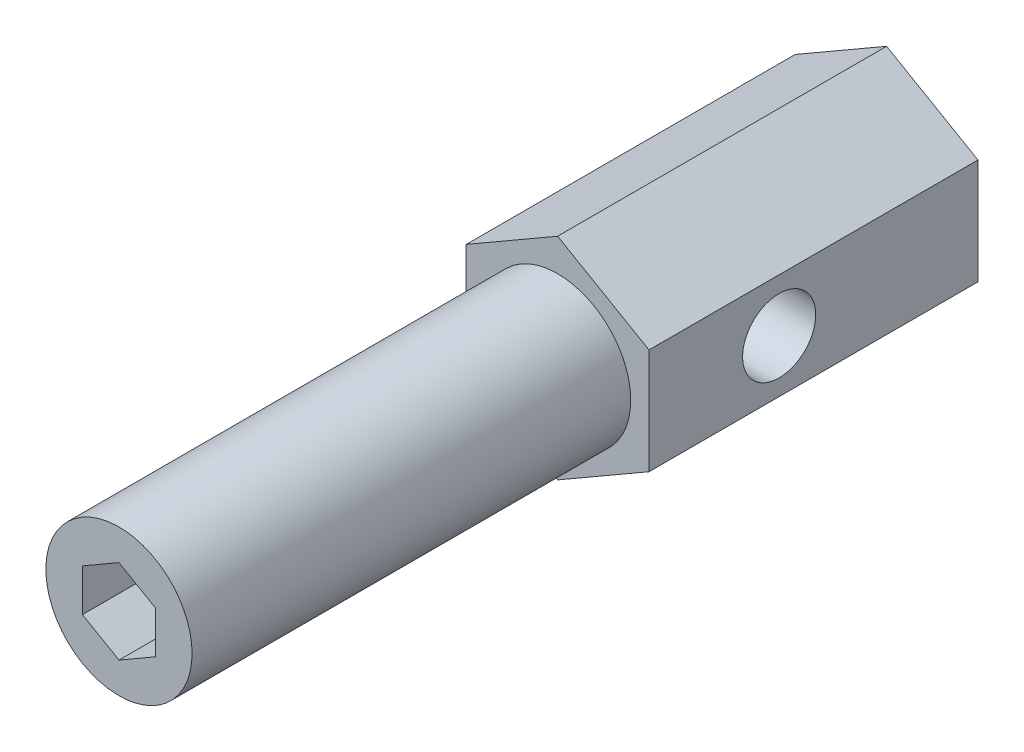
ISO-10303-21;
HEADER;
FILE_DESCRIPTION(('STEP AP214'),'2;1');
FILE_NAME('part.step','',(''),(''),'','','');
FILE_SCHEMA(('AUTOMOTIVE_DESIGN { 1 0 10303 214 1 1 1 1 }'));
ENDSEC;
DATA;
#1=APPLICATION_CONTEXT('core data for automotive mechanical design processes');
#2=APPLICATION_PROTOCOL_DEFINITION('international standard','automotive_design',2000,#1);
#3=PRODUCT_CONTEXT('',#1,'mechanical');
#4=PRODUCT('Part','Part','',(#3));
#5=PRODUCT_RELATED_PRODUCT_CATEGORY('part','',(#4));
#6=PRODUCT_DEFINITION_FORMATION('','',#4);
#7=PRODUCT_DEFINITION_CONTEXT('part definition',#1,'design');
#8=PRODUCT_DEFINITION('design','',#6,#7);
#9=PRODUCT_DEFINITION_SHAPE('','',#8);
#10=(LENGTH_UNIT() NAMED_UNIT(*) SI_UNIT(.MILLI.,.METRE.));
#11=(NAMED_UNIT(*) PLANE_ANGLE_UNIT() SI_UNIT($,.RADIAN.));
#12=(NAMED_UNIT(*) SI_UNIT($,.STERADIAN.) SOLID_ANGLE_UNIT());
#13=UNCERTAINTY_MEASURE_WITH_UNIT(LENGTH_MEASURE(1.E-05),#10,'distance_accuracy_value','');
#14=(GEOMETRIC_REPRESENTATION_CONTEXT(3) GLOBAL_UNCERTAINTY_ASSIGNED_CONTEXT((#13)) GLOBAL_UNIT_ASSIGNED_CONTEXT((#10,
#11,#12)) REPRESENTATION_CONTEXT('',''));
#15=CARTESIAN_POINT('',(0.,0.,0.));
#16=DIRECTION('',(0.,0.,1.));
#17=DIRECTION('',(1.,0.,0.));
#18=AXIS2_PLACEMENT_3D('',#15,#16,#17);
#19=CARTESIAN_POINT('',(0.,0.,152.4));
#20=DIRECTION('',(0.,0.,1.));
#21=DIRECTION('',(1.,0.,0.));
#22=AXIS2_PLACEMENT_3D('',#19,#20,#21);
#23=PLANE('',#22);
#24=DIRECTION('',(-0.866025403784439,0.5,0.));
#25=VECTOR('',#24,1.);
#26=CARTESIAN_POINT('',(6.35,3.66617420935413,152.4));
#27=LINE('',#26,#25);
#28=CARTESIAN_POINT('',(6.35,3.66617420935413,152.4));
#29=VERTEX_POINT('',#28);
#30=CARTESIAN_POINT('',(0.,7.33234841870825,152.4));
#31=VERTEX_POINT('',#30);
#32=EDGE_CURVE('E56',#29,#31,#27,.T.);
#33=ORIENTED_EDGE('',*,*,#32,.F.);
#34=DIRECTION('',(0.,1.,0.));
#35=VECTOR('',#34,1.);
#36=CARTESIAN_POINT('',(6.35,-3.66617420935412,152.4));
#37=LINE('',#36,#35);
#38=CARTESIAN_POINT('',(6.35,-3.66617420935412,152.4));
#39=VERTEX_POINT('',#38);
#40=EDGE_CURVE('E190',#39,#29,#37,.T.);
#41=ORIENTED_EDGE('',*,*,#40,.F.);
#42=DIRECTION('',(0.866025403784439,0.5,0.));
#43=VECTOR('',#42,1.);
#44=CARTESIAN_POINT('',(0.,-7.33234841870825,152.4));
#45=LINE('',#44,#43);
#46=CARTESIAN_POINT('',(0.,-7.33234841870825,152.4));
#47=VERTEX_POINT('',#46);
#48=EDGE_CURVE('E216',#47,#39,#45,.T.);
#49=ORIENTED_EDGE('',*,*,#48,.F.);
#50=DIRECTION('',(0.866025403784438,-0.5,0.));
#51=VECTOR('',#50,1.);
#52=CARTESIAN_POINT('',(-6.35,-3.66617420935412,152.4));
#53=LINE('',#52,#51);
#54=CARTESIAN_POINT('',(-6.35,-3.66617420935412,152.4));
#55=VERTEX_POINT('',#54);
#56=EDGE_CURVE('E213',#55,#47,#53,.T.);
#57=ORIENTED_EDGE('',*,*,#56,.F.);
#58=DIRECTION('',(0.,-1.,0.));
#59=VECTOR('',#58,1.);
#60=CARTESIAN_POINT('',(-6.35,3.66617420935412,152.4));
#61=LINE('',#60,#59);
#62=CARTESIAN_POINT('',(-6.35,3.66617420935412,152.4));
#63=VERTEX_POINT('',#62);
#64=EDGE_CURVE('E210',#63,#55,#61,.T.);
#65=ORIENTED_EDGE('',*,*,#64,.F.);
#66=DIRECTION('',(-0.866025403784439,-0.5,0.));
#67=VECTOR('',#66,1.);
#68=CARTESIAN_POINT('',(0.,7.33234841870825,152.4));
#69=LINE('',#68,#67);
#70=EDGE_CURVE('E207',#31,#63,#69,.T.);
#71=ORIENTED_EDGE('',*,*,#70,.F.);
#72=EDGE_LOOP('',(#33,#41,#49,#57,#65,#71));
#73=FACE_BOUND('',#72,.T.);
#74=CARTESIAN_POINT('',(0.,0.,152.4));
#75=DIRECTION('',(0.,0.,1.));
#76=DIRECTION('',(1.,0.,0.));
#77=AXIS2_PLACEMENT_3D('',#74,#75,#76);
#78=CIRCLE('',#77,12.7);
#79=CARTESIAN_POINT('',(12.7,0.,152.4));
#80=VERTEX_POINT('',#79);
#81=EDGE_CURVE('E412',#80,#80,#78,.T.);
#82=ORIENTED_EDGE('',*,*,#81,.T.);
#83=EDGE_LOOP('',(#82));
#84=FACE_BOUND('',#83,.T.);
#85=ADVANCED_FACE('F34',(#73,#84),#23,.T.);
#86=CARTESIAN_POINT('',(6.35,3.66617420935413,112.268));
#87=DIRECTION('',(0.5,0.866025403784439,0.));
#88=DIRECTION('',(-0.866025403784439,0.5,0.));
#89=AXIS2_PLACEMENT_3D('',#86,#87,#88);
#90=PLANE('',#89);
#91=ORIENTED_EDGE('',*,*,#32,.T.);
#92=DIRECTION('',(0.,0.,1.));
#93=VECTOR('',#92,1.);
#94=CARTESIAN_POINT('',(0.,7.33234841870825,112.268));
#95=LINE('',#94,#93);
#96=CARTESIAN_POINT('',(0.,7.33234841870825,112.268));
#97=VERTEX_POINT('',#96);
#98=EDGE_CURVE('E205',#97,#31,#95,.T.);
#99=ORIENTED_EDGE('',*,*,#98,.F.);
#100=DIRECTION('',(-0.866025403784439,0.5,0.));
#101=VECTOR('',#100,1.);
#102=CARTESIAN_POINT('',(6.35,3.66617420935413,112.268));
#103=LINE('',#102,#101);
#104=CARTESIAN_POINT('',(6.35,3.66617420935413,112.268));
#105=VERTEX_POINT('',#104);
#106=EDGE_CURVE('E186',#105,#97,#103,.T.);
#107=ORIENTED_EDGE('',*,*,#106,.F.);
#108=DIRECTION('',(0.,0.,1.));
#109=VECTOR('',#108,1.);
#110=CARTESIAN_POINT('',(6.35,3.66617420935413,112.268));
#111=LINE('',#110,#109);
#112=EDGE_CURVE('E162',#105,#29,#111,.T.);
#113=ORIENTED_EDGE('',*,*,#112,.T.);
#114=EDGE_LOOP('',(#91,#99,#107,#113));
#115=FACE_BOUND('',#114,.T.);
#116=ADVANCED_FACE('F247',(#115),#90,.F.);
#117=CARTESIAN_POINT('',(6.35,-3.66617420935412,112.268));
#118=DIRECTION('',(1.,0.,0.));
#119=DIRECTION('',(0.,1.,0.));
#120=AXIS2_PLACEMENT_3D('',#117,#118,#119);
#121=PLANE('',#120);
#122=ORIENTED_EDGE('',*,*,#40,.T.);
#123=ORIENTED_EDGE('',*,*,#112,.F.);
#124=DIRECTION('',(0.,1.,0.));
#125=VECTOR('',#124,1.);
#126=CARTESIAN_POINT('',(6.35,-3.66617420935412,112.268));
#127=LINE('',#126,#125);
#128=CARTESIAN_POINT('',(6.35,-3.66617420935412,112.268));
#129=VERTEX_POINT('',#128);
#130=EDGE_CURVE('E202',#129,#105,#127,.T.);
#131=ORIENTED_EDGE('',*,*,#130,.F.);
#132=DIRECTION('',(0.,0.,1.));
#133=VECTOR('',#132,1.);
#134=CARTESIAN_POINT('',(6.35,-3.66617420935412,112.268));
#135=LINE('',#134,#133);
#136=EDGE_CURVE('E222',#129,#39,#135,.T.);
#137=ORIENTED_EDGE('',*,*,#136,.T.);
#138=EDGE_LOOP('',(#122,#123,#131,#137));
#139=FACE_BOUND('',#138,.T.);
#140=ADVANCED_FACE('F249',(#139),#121,.F.);
#141=CARTESIAN_POINT('',(0.,-7.33234841870825,112.268));
#142=DIRECTION('',(0.5,-0.866025403784439,0.));
#143=DIRECTION('',(0.866025403784439,0.5,0.));
#144=AXIS2_PLACEMENT_3D('',#141,#142,#143);
#145=PLANE('',#144);
#146=ORIENTED_EDGE('',*,*,#48,.T.);
#147=ORIENTED_EDGE('',*,*,#136,.F.);
#148=DIRECTION('',(0.866025403784439,0.5,0.));
#149=VECTOR('',#148,1.);
#150=CARTESIAN_POINT('',(0.,-7.33234841870825,112.268));
#151=LINE('',#150,#149);
#152=CARTESIAN_POINT('',(0.,-7.33234841870825,112.268));
#153=VERTEX_POINT('',#152);
#154=EDGE_CURVE('E199',#153,#129,#151,.T.);
#155=ORIENTED_EDGE('',*,*,#154,.F.);
#156=DIRECTION('',(0.,0.,1.));
#157=VECTOR('',#156,1.);
#158=CARTESIAN_POINT('',(0.,-7.33234841870825,112.268));
#159=LINE('',#158,#157);
#160=EDGE_CURVE('E224',#153,#47,#159,.T.);
#161=ORIENTED_EDGE('',*,*,#160,.T.);
#162=EDGE_LOOP('',(#146,#147,#155,#161));
#163=FACE_BOUND('',#162,.T.);
#164=ADVANCED_FACE('F251',(#163),#145,.F.);
#165=CARTESIAN_POINT('',(-6.35,-3.66617420935412,112.268));
#166=DIRECTION('',(-0.5,-0.866025403784439,0.));
#167=DIRECTION('',(0.866025403784439,-0.5,0.));
#168=AXIS2_PLACEMENT_3D('',#165,#166,#167);
#169=PLANE('',#168);
#170=ORIENTED_EDGE('',*,*,#56,.T.);
#171=ORIENTED_EDGE('',*,*,#160,.F.);
#172=DIRECTION('',(0.866025403784438,-0.5,0.));
#173=VECTOR('',#172,1.);
#174=CARTESIAN_POINT('',(-6.35,-3.66617420935412,112.268));
#175=LINE('',#174,#173);
#176=CARTESIAN_POINT('',(-6.35,-3.66617420935412,112.268));
#177=VERTEX_POINT('',#176);
#178=EDGE_CURVE('E196',#177,#153,#175,.T.);
#179=ORIENTED_EDGE('',*,*,#178,.F.);
#180=DIRECTION('',(0.,0.,1.));
#181=VECTOR('',#180,1.);
#182=CARTESIAN_POINT('',(-6.35,-3.66617420935412,112.268));
#183=LINE('',#182,#181);
#184=EDGE_CURVE('E226',#177,#55,#183,.T.);
#185=ORIENTED_EDGE('',*,*,#184,.T.);
#186=EDGE_LOOP('',(#170,#171,#179,#185));
#187=FACE_BOUND('',#186,.T.);
#188=ADVANCED_FACE('F254',(#187),#169,.F.);
#189=CARTESIAN_POINT('',(-6.35,3.66617420935412,112.268));
#190=DIRECTION('',(-1.,0.,0.));
#191=DIRECTION('',(0.,0.,1.));
#192=AXIS2_PLACEMENT_3D('',#189,#190,#191);
#193=PLANE('',#192);
#194=ORIENTED_EDGE('',*,*,#64,.T.);
#195=ORIENTED_EDGE('',*,*,#184,.F.);
#196=DIRECTION('',(0.,-1.,0.));
#197=VECTOR('',#196,1.);
#198=CARTESIAN_POINT('',(-6.35,3.66617420935412,112.268));
#199=LINE('',#198,#197);
#200=CARTESIAN_POINT('',(-6.35,3.66617420935412,112.268));
#201=VERTEX_POINT('',#200);
#202=EDGE_CURVE('E193',#201,#177,#199,.T.);
#203=ORIENTED_EDGE('',*,*,#202,.F.);
#204=DIRECTION('',(0.,0.,1.));
#205=VECTOR('',#204,1.);
#206=CARTESIAN_POINT('',(-6.35,3.66617420935412,112.268));
#207=LINE('',#206,#205);
#208=EDGE_CURVE('E228',#201,#63,#207,.T.);
#209=ORIENTED_EDGE('',*,*,#208,.T.);
#210=EDGE_LOOP('',(#194,#195,#203,#209));
#211=FACE_BOUND('',#210,.T.);
#212=ADVANCED_FACE('F241',(#211),#193,.F.);
#213=CARTESIAN_POINT('',(0.,7.33234841870825,112.268));
#214=DIRECTION('',(-0.5,0.866025403784439,0.));
#215=DIRECTION('',(-0.866025403784439,-0.5,0.));
#216=AXIS2_PLACEMENT_3D('',#213,#214,#215);
#217=PLANE('',#216);
#218=ORIENTED_EDGE('',*,*,#70,.T.);
#219=ORIENTED_EDGE('',*,*,#208,.F.);
#220=DIRECTION('',(-0.866025403784439,-0.5,0.));
#221=VECTOR('',#220,1.);
#222=CARTESIAN_POINT('',(0.,7.33234841870825,112.268));
#223=LINE('',#222,#221);
#224=EDGE_CURVE('E189',#97,#201,#223,.T.);
#225=ORIENTED_EDGE('',*,*,#224,.F.);
#226=ORIENTED_EDGE('',*,*,#98,.T.);
#227=EDGE_LOOP('',(#218,#219,#225,#226));
#228=FACE_BOUND('',#227,.T.);
#229=ADVANCED_FACE('F232',(#228),#217,.F.);
#230=CARTESIAN_POINT('',(0.,0.,112.268));
#231=DIRECTION('',(0.,0.,1.));
#232=DIRECTION('',(1.,0.,0.));
#233=AXIS2_PLACEMENT_3D('',#230,#231,#232);
#234=PLANE('',#233);
#235=ORIENTED_EDGE('',*,*,#106,.T.);
#236=ORIENTED_EDGE('',*,*,#224,.T.);
#237=ORIENTED_EDGE('',*,*,#202,.T.);
#238=ORIENTED_EDGE('',*,*,#178,.T.);
#239=ORIENTED_EDGE('',*,*,#154,.T.);
#240=ORIENTED_EDGE('',*,*,#130,.T.);
#241=EDGE_LOOP('',(#235,#236,#237,#238,#239,#240));
#242=FACE_BOUND('',#241,.T.);
#243=ADVANCED_FACE('F245',(#242),#234,.T.);
#244=CARTESIAN_POINT('',(0.,0.,76.2));
#245=DIRECTION('',(0.,0.,1.));
#246=DIRECTION('',(1.,0.,0.));
#247=AXIS2_PLACEMENT_3D('',#244,#245,#246);
#248=PLANE('',#247);
#249=CARTESIAN_POINT('',(0.,0.,76.2));
#250=DIRECTION('',(0.,0.,1.));
#251=DIRECTION('',(1.,0.,0.));
#252=AXIS2_PLACEMENT_3D('',#249,#250,#251);
#253=CIRCLE('',#252,12.7);
#254=CARTESIAN_POINT('',(12.7,0.,76.2));
#255=VERTEX_POINT('',#254);
#256=EDGE_CURVE('E411',#255,#255,#253,.T.);
#257=ORIENTED_EDGE('',*,*,#256,.F.);
#258=EDGE_LOOP('',(#257));
#259=FACE_BOUND('',#258,.T.);
#260=DIRECTION('',(-0.866025403784439,0.5,0.));
#261=VECTOR('',#260,1.);
#262=CARTESIAN_POINT('',(15.875,9.16543552338531,76.2));
#263=LINE('',#262,#261);
#264=CARTESIAN_POINT('',(15.875,9.16543552338531,76.2));
#265=VERTEX_POINT('',#264);
#266=CARTESIAN_POINT('',(0.,18.3308710467706,76.2));
#267=VERTEX_POINT('',#266);
#268=EDGE_CURVE('E121',#265,#267,#263,.T.);
#269=ORIENTED_EDGE('',*,*,#268,.T.);
#270=DIRECTION('',(-0.866025403784438,-0.5,0.));
#271=VECTOR('',#270,1.);
#272=CARTESIAN_POINT('',(0.,18.3308710467706,76.2));
#273=LINE('',#272,#271);
#274=CARTESIAN_POINT('',(-15.875,9.1654355233853,76.2));
#275=VERTEX_POINT('',#274);
#276=EDGE_CURVE('E131',#267,#275,#273,.T.);
#277=ORIENTED_EDGE('',*,*,#276,.T.);
#278=DIRECTION('',(0.,-1.,0.));
#279=VECTOR('',#278,1.);
#280=CARTESIAN_POINT('',(-15.875,9.1654355233853,76.2));
#281=LINE('',#280,#279);
#282=CARTESIAN_POINT('',(-15.875,-9.16543552338533,76.2));
#283=VERTEX_POINT('',#282);
#284=EDGE_CURVE('E178',#275,#283,#281,.T.);
#285=ORIENTED_EDGE('',*,*,#284,.T.);
#286=DIRECTION('',(0.866025403784439,-0.5,0.));
#287=VECTOR('',#286,1.);
#288=CARTESIAN_POINT('',(-15.875,-9.16543552338532,76.2));
#289=LINE('',#288,#287);
#290=CARTESIAN_POINT('',(0.,-18.3308710467706,76.2));
#291=VERTEX_POINT('',#290);
#292=EDGE_CURVE('E180',#283,#291,#289,.T.);
#293=ORIENTED_EDGE('',*,*,#292,.T.);
#294=DIRECTION('',(0.866025403784439,0.5,0.));
#295=VECTOR('',#294,1.);
#296=CARTESIAN_POINT('',(0.,-18.3308710467706,76.2));
#297=LINE('',#296,#295);
#298=CARTESIAN_POINT('',(15.875,-9.16543552338531,76.2));
#299=VERTEX_POINT('',#298);
#300=EDGE_CURVE('E48',#291,#299,#297,.T.);
#301=ORIENTED_EDGE('',*,*,#300,.T.);
#302=DIRECTION('',(0.,1.,0.));
#303=VECTOR('',#302,1.);
#304=CARTESIAN_POINT('',(15.875,-9.16543552338531,76.2));
#305=LINE('',#304,#303);
#306=EDGE_CURVE('E11',#299,#265,#305,.T.);
#307=ORIENTED_EDGE('',*,*,#306,.T.);
#308=EDGE_LOOP('',(#269,#277,#285,#293,#301,#307));
#309=FACE_BOUND('',#308,.T.);
#310=ADVANCED_FACE('F120',(#259,#309),#248,.T.);
#311=CARTESIAN_POINT('',(0.,0.,76.2));
#312=DIRECTION('',(0.,0.,1.));
#313=DIRECTION('',(1.,0.,0.));
#314=AXIS2_PLACEMENT_3D('',#311,#312,#313);
#315=CYLINDRICAL_SURFACE('',#314,12.7);
#316=CARTESIAN_POINT('',(12.7,0.,76.2));
#317=CARTESIAN_POINT('',(12.7,0.,76.99375));
#318=CARTESIAN_POINT('',(12.7,0.,77.7875));
#319=CARTESIAN_POINT('',(12.7,0.,79.375));
#320=CARTESIAN_POINT('',(12.7,0.,80.16875));
#321=CARTESIAN_POINT('',(12.7,0.,81.75625));
#322=CARTESIAN_POINT('',(12.7,0.,82.55));
#323=CARTESIAN_POINT('',(12.7,0.,84.1375));
#324=CARTESIAN_POINT('',(12.7,0.,84.93125));
#325=CARTESIAN_POINT('',(12.7,0.,86.51875));
#326=CARTESIAN_POINT('',(12.7,0.,87.3125));
#327=CARTESIAN_POINT('',(12.7,0.,88.9));
#328=CARTESIAN_POINT('',(12.7,0.,89.69375));
#329=CARTESIAN_POINT('',(12.7,0.,91.28125));
#330=CARTESIAN_POINT('',(12.7,0.,92.075));
#331=CARTESIAN_POINT('',(12.7,0.,93.6625));
#332=CARTESIAN_POINT('',(12.7,0.,94.45625));
#333=CARTESIAN_POINT('',(12.7,0.,96.04375));
#334=CARTESIAN_POINT('',(12.7,0.,96.8375));
#335=CARTESIAN_POINT('',(12.7,0.,98.425));
#336=CARTESIAN_POINT('',(12.7,0.,99.21875));
#337=CARTESIAN_POINT('',(12.7,0.,100.80625));
#338=CARTESIAN_POINT('',(12.7,0.,101.6));
#339=CARTESIAN_POINT('',(12.7,0.,103.1875));
#340=CARTESIAN_POINT('',(12.7,0.,103.98125));
#341=CARTESIAN_POINT('',(12.7,0.,105.56875));
#342=CARTESIAN_POINT('',(12.7,0.,106.3625));
#343=CARTESIAN_POINT('',(12.7,0.,107.95));
#344=CARTESIAN_POINT('',(12.7,0.,108.74375));
#345=CARTESIAN_POINT('',(12.7,0.,110.33125));
#346=CARTESIAN_POINT('',(12.7,0.,111.125));
#347=CARTESIAN_POINT('',(12.7,0.,112.7125));
#348=CARTESIAN_POINT('',(12.7,0.,113.50625));
#349=CARTESIAN_POINT('',(12.7,0.,115.09375));
#350=CARTESIAN_POINT('',(12.7,0.,115.8875));
#351=CARTESIAN_POINT('',(12.7,0.,117.475));
#352=CARTESIAN_POINT('',(12.7,0.,118.26875));
#353=CARTESIAN_POINT('',(12.7,0.,119.85625));
#354=CARTESIAN_POINT('',(12.7,0.,120.65));
#355=CARTESIAN_POINT('',(12.7,0.,122.2375));
#356=CARTESIAN_POINT('',(12.7,0.,123.03125));
#357=CARTESIAN_POINT('',(12.7,0.,124.61875));
#358=CARTESIAN_POINT('',(12.7,0.,125.4125));
#359=CARTESIAN_POINT('',(12.7,0.,127.));
#360=CARTESIAN_POINT('',(12.7,0.,127.79375));
#361=CARTESIAN_POINT('',(12.7,0.,129.38125));
#362=CARTESIAN_POINT('',(12.7,0.,130.175));
#363=CARTESIAN_POINT('',(12.7,0.,131.7625));
#364=CARTESIAN_POINT('',(12.7,0.,132.55625));
#365=CARTESIAN_POINT('',(12.7,0.,134.14375));
#366=CARTESIAN_POINT('',(12.7,0.,134.9375));
#367=CARTESIAN_POINT('',(12.7,0.,136.525));
#368=CARTESIAN_POINT('',(12.7,0.,137.31875));
#369=CARTESIAN_POINT('',(12.7,0.,138.90625));
#370=CARTESIAN_POINT('',(12.7,0.,139.7));
#371=CARTESIAN_POINT('',(12.7,0.,141.2875));
#372=CARTESIAN_POINT('',(12.7,0.,142.08125));
#373=CARTESIAN_POINT('',(12.7,0.,143.66875));
#374=CARTESIAN_POINT('',(12.7,0.,144.4625));
#375=CARTESIAN_POINT('',(12.7,0.,146.05));
#376=CARTESIAN_POINT('',(12.7,0.,146.84375));
#377=CARTESIAN_POINT('',(12.7,0.,148.43125));
#378=CARTESIAN_POINT('',(12.7,0.,149.225));
#379=CARTESIAN_POINT('',(12.7,0.,150.8125));
#380=CARTESIAN_POINT('',(12.7,0.,151.60625));
#381=CARTESIAN_POINT('',(12.7,0.,152.4));
#382=B_SPLINE_CURVE_WITH_KNOTS('',3,(#316,#317,#318,#319,#320,#321,#322,#323,#324,#325,#326,
#327,#328,#329,#330,#331,#332,#333,#334,#335,#336,#337,#338,#339,#340,#341,#342,#343,#344,#345,
#346,#347,#348,#349,#350,#351,#352,#353,#354,#355,#356,#357,#358,#359,#360,#361,#362,#363,#364,
#365,#366,#367,#368,#369,#370,#371,#372,#373,#374,#375,#376,#377,#378,#379,#380,#381),
.UNSPECIFIED.,.F.,.F.,(4,2,2,2,2,2,2,2,2,2,2,2,2,2,2,2,2,2,2,2,2,2,2,2,2,2,2,2,2,2,2,2,4),(0.,
2.38125,4.7625,7.14375,9.52500000000001,11.90625,14.2875,16.66875,19.05,21.43125,23.8125,
26.19375,28.575,30.95625,33.3375,35.71875,38.1,40.48125,42.8625,45.24375,47.625,50.00625,
52.3875,54.76875,57.15,59.53125,61.9125,64.29375,66.675,69.05625,71.4375,73.81875,76.2),.UNSPECIFIED.);
#383=EDGE_CURVE('BSEAM301',#255,#80,#382,.T.);
#384=ORIENTED_EDGE('',*,*,#256,.T.);
#385=ORIENTED_EDGE('',*,*,#81,.F.);
#386=ORIENTED_EDGE('',*,*,#383,.T.);
#387=ORIENTED_EDGE('',*,*,#383,.F.);
#388=EDGE_LOOP('',(#384,#386,#385,#387));
#389=FACE_BOUND('',#388,.T.);
#390=ADVANCED_FACE('F301',(#389),#315,.T.);
#391=CARTESIAN_POINT('',(0.,0.,19.05));
#392=DIRECTION('',(0.,0.,-1.));
#393=DIRECTION('',(-1.,0.,0.));
#394=AXIS2_PLACEMENT_3D('',#391,#392,#393);
#395=PLANE('',#394);
#396=DIRECTION('',(0.866025403784441,0.499999999999995,0.));
#397=VECTOR('',#396,1.);
#398=CARTESIAN_POINT('',(-15.8749999999999,9.16543552338549,19.05));
#399=LINE('',#398,#397);
#400=CARTESIAN_POINT('',(-15.8749999999999,9.16543552338549,19.05));
#401=VERTEX_POINT('',#400);
#402=CARTESIAN_POINT('',(0.,18.3308710467706,19.05));
#403=VERTEX_POINT('',#402);
#404=EDGE_CURVE('E156',#401,#403,#399,.T.);
#405=ORIENTED_EDGE('',*,*,#404,.T.);
#406=DIRECTION('',(0.866025403784438,-0.500000000000001,0.));
#407=VECTOR('',#406,1.);
#408=CARTESIAN_POINT('',(0.,18.3308710467706,19.05));
#409=LINE('',#408,#407);
#410=CARTESIAN_POINT('',(15.875,9.16543552338531,19.05));
#411=VERTEX_POINT('',#410);
#412=EDGE_CURVE('E159',#403,#411,#409,.T.);
#413=ORIENTED_EDGE('',*,*,#412,.T.);
#414=DIRECTION('',(0.,-1.,0.));
#415=VECTOR('',#414,1.);
#416=CARTESIAN_POINT('',(15.875,9.16543552338528,19.05));
#417=LINE('',#416,#415);
#418=CARTESIAN_POINT('',(15.875,-9.16543552338537,19.05));
#419=VERTEX_POINT('',#418);
#420=EDGE_CURVE('E136',#411,#419,#417,.T.);
#421=ORIENTED_EDGE('',*,*,#420,.T.);
#422=DIRECTION('',(-0.866025403784441,-0.499999999999995,0.));
#423=VECTOR('',#422,1.);
#424=CARTESIAN_POINT('',(15.875,-9.16543552338537,19.05));
#425=LINE('',#424,#423);
#426=CARTESIAN_POINT('',(-1.17397558148957E-13,-18.3308710467706,19.05));
#427=VERTEX_POINT('',#426);
#428=EDGE_CURVE('E165',#419,#427,#425,.T.);
#429=ORIENTED_EDGE('',*,*,#428,.T.);
#430=DIRECTION('',(-0.866025403784435,0.500000000000007,0.));
#431=VECTOR('',#430,1.);
#432=CARTESIAN_POINT('',(-1.17397558148957E-13,-18.3308710467706,19.05));
#433=LINE('',#432,#431);
#434=CARTESIAN_POINT('',(-15.8750000000001,-9.16543552338517,19.05));
#435=VERTEX_POINT('',#434);
#436=EDGE_CURVE('E143',#427,#435,#433,.T.);
#437=ORIENTED_EDGE('',*,*,#436,.T.);
#438=DIRECTION('',(0.,1.,0.));
#439=VECTOR('',#438,1.);
#440=CARTESIAN_POINT('',(-15.8750000000001,-9.16543552338517,19.05));
#441=LINE('',#440,#439);
#442=EDGE_CURVE('E138',#435,#401,#441,.T.);
#443=ORIENTED_EDGE('',*,*,#442,.T.);
#444=EDGE_LOOP('',(#405,#413,#421,#429,#437,#443));
#445=FACE_BOUND('',#444,.T.);
#446=ADVANCED_FACE('F158',(#445),#395,.T.);
#447=CARTESIAN_POINT('',(15.875,-9.16543552338531,152.4));
#448=DIRECTION('',(-1.,0.,0.));
#449=DIRECTION('',(0.,0.,1.));
#450=AXIS2_PLACEMENT_3D('',#447,#448,#449);
#451=PLANE('',#450);
#452=CARTESIAN_POINT('',(15.875,0.,53.594));
#453=DIRECTION('',(1.,0.,0.));
#454=DIRECTION('',(0.,0.,-1.));
#455=AXIS2_PLACEMENT_3D('',#452,#453,#454);
#456=CIRCLE('',#455,6.35);
#457=CARTESIAN_POINT('',(15.875,0.,47.244));
#458=VERTEX_POINT('',#457);
#459=EDGE_CURVE('E418',#458,#458,#456,.T.);
#460=ORIENTED_EDGE('',*,*,#459,.F.);
#461=EDGE_LOOP('',(#460));
#462=FACE_BOUND('',#461,.T.);
#463=ORIENTED_EDGE('',*,*,#306,.F.);
#464=DIRECTION('',(0.,0.,-1.));
#465=VECTOR('',#464,1.);
#466=CARTESIAN_POINT('',(15.875,-9.16543552338531,152.4));
#467=LINE('',#466,#465);
#468=EDGE_CURVE('E137',#299,#419,#467,.T.);
#469=ORIENTED_EDGE('',*,*,#468,.T.);
#470=ORIENTED_EDGE('',*,*,#420,.F.);
#471=DIRECTION('',(0.,0.,-1.));
#472=VECTOR('',#471,1.);
#473=CARTESIAN_POINT('',(15.875,9.16543552338531,152.4));
#474=LINE('',#473,#472);
#475=EDGE_CURVE('E129',#265,#411,#474,.T.);
#476=ORIENTED_EDGE('',*,*,#475,.F.);
#477=EDGE_LOOP('',(#463,#469,#470,#476));
#478=FACE_BOUND('',#477,.T.);
#479=ADVANCED_FACE('F134',(#462,#478),#451,.F.);
#480=CARTESIAN_POINT('',(0.,-18.3308710467706,152.4));
#481=DIRECTION('',(-0.5,0.866025403784439,0.));
#482=DIRECTION('',(-0.866025403784439,-0.5,0.));
#483=AXIS2_PLACEMENT_3D('',#480,#481,#482);
#484=PLANE('',#483);
#485=ORIENTED_EDGE('',*,*,#300,.F.);
#486=DIRECTION('',(0.,0.,-1.));
#487=VECTOR('',#486,1.);
#488=CARTESIAN_POINT('',(0.,-18.3308710467706,152.4));
#489=LINE('',#488,#487);
#490=EDGE_CURVE('E140',#291,#427,#489,.T.);
#491=ORIENTED_EDGE('',*,*,#490,.T.);
#492=ORIENTED_EDGE('',*,*,#428,.F.);
#493=ORIENTED_EDGE('',*,*,#468,.F.);
#494=EDGE_LOOP('',(#485,#491,#492,#493));
#495=FACE_BOUND('',#494,.T.);
#496=ADVANCED_FACE('F275',(#495),#484,.F.);
#497=CARTESIAN_POINT('',(-15.875,-9.16543552338532,152.4));
#498=DIRECTION('',(0.5,0.866025403784439,0.));
#499=DIRECTION('',(-0.866025403784439,0.5,0.));
#500=AXIS2_PLACEMENT_3D('',#497,#498,#499);
#501=PLANE('',#500);
#502=ORIENTED_EDGE('',*,*,#292,.F.);
#503=DIRECTION('',(0.,0.,-1.));
#504=VECTOR('',#503,1.);
#505=CARTESIAN_POINT('',(-15.875,-9.16543552338532,152.4));
#506=LINE('',#505,#504);
#507=EDGE_CURVE('E148',#283,#435,#506,.T.);
#508=ORIENTED_EDGE('',*,*,#507,.T.);
#509=ORIENTED_EDGE('',*,*,#436,.F.);
#510=ORIENTED_EDGE('',*,*,#490,.F.);
#511=EDGE_LOOP('',(#502,#508,#509,#510));
#512=FACE_BOUND('',#511,.T.);
#513=ADVANCED_FACE('F279',(#512),#501,.F.);
#514=CARTESIAN_POINT('',(-15.875,9.1654355233853,152.4));
#515=DIRECTION('',(1.,0.,0.));
#516=DIRECTION('',(0.,1.,0.));
#517=AXIS2_PLACEMENT_3D('',#514,#515,#516);
#518=PLANE('',#517);
#519=CARTESIAN_POINT('',(-15.8750000000001,0.,53.594));
#520=DIRECTION('',(1.,0.,0.));
#521=DIRECTION('',(0.,0.,-1.));
#522=AXIS2_PLACEMENT_3D('',#519,#520,#521);
#523=CIRCLE('',#522,6.35);
#524=CARTESIAN_POINT('',(-15.8750000000001,0.,47.244));
#525=VERTEX_POINT('',#524);
#526=EDGE_CURVE('E415',#525,#525,#523,.T.);
#527=ORIENTED_EDGE('',*,*,#526,.T.);
#528=EDGE_LOOP('',(#527));
#529=FACE_BOUND('',#528,.T.);
#530=ORIENTED_EDGE('',*,*,#284,.F.);
#531=DIRECTION('',(0.,0.,-1.));
#532=VECTOR('',#531,1.);
#533=CARTESIAN_POINT('',(-15.875,9.1654355233853,152.4));
#534=LINE('',#533,#532);
#535=EDGE_CURVE('E150',#275,#401,#534,.T.);
#536=ORIENTED_EDGE('',*,*,#535,.T.);
#537=ORIENTED_EDGE('',*,*,#442,.F.);
#538=ORIENTED_EDGE('',*,*,#507,.F.);
#539=EDGE_LOOP('',(#530,#536,#537,#538));
#540=FACE_BOUND('',#539,.T.);
#541=ADVANCED_FACE('F177',(#529,#540),#518,.F.);
#542=CARTESIAN_POINT('',(0.,18.3308710467706,152.4));
#543=DIRECTION('',(0.5,-0.866025403784438,0.));
#544=DIRECTION('',(0.866025403784438,0.5,0.));
#545=AXIS2_PLACEMENT_3D('',#542,#543,#544);
#546=PLANE('',#545);
#547=ORIENTED_EDGE('',*,*,#276,.F.);
#548=DIRECTION('',(0.,0.,-1.));
#549=VECTOR('',#548,1.);
#550=CARTESIAN_POINT('',(0.,18.3308710467706,152.4));
#551=LINE('',#550,#549);
#552=EDGE_CURVE('E42',#267,#403,#551,.T.);
#553=ORIENTED_EDGE('',*,*,#552,.T.);
#554=ORIENTED_EDGE('',*,*,#404,.F.);
#555=ORIENTED_EDGE('',*,*,#535,.F.);
#556=EDGE_LOOP('',(#547,#553,#554,#555));
#557=FACE_BOUND('',#556,.T.);
#558=ADVANCED_FACE('F154',(#557),#546,.F.);
#559=CARTESIAN_POINT('',(15.875,9.16543552338531,152.4));
#560=DIRECTION('',(-0.5,-0.866025403784439,0.));
#561=DIRECTION('',(0.866025403784439,-0.5,0.));
#562=AXIS2_PLACEMENT_3D('',#559,#560,#561);
#563=PLANE('',#562);
#564=ORIENTED_EDGE('',*,*,#268,.F.);
#565=ORIENTED_EDGE('',*,*,#475,.T.);
#566=ORIENTED_EDGE('',*,*,#412,.F.);
#567=ORIENTED_EDGE('',*,*,#552,.F.);
#568=EDGE_LOOP('',(#564,#565,#566,#567));
#569=FACE_BOUND('',#568,.T.);
#570=ADVANCED_FACE('F36',(#569),#563,.F.);
#571=CARTESIAN_POINT('',(-15.8750000000001,0.,53.594));
#572=DIRECTION('',(1.,0.,0.));
#573=DIRECTION('',(0.,0.,-1.));
#574=AXIS2_PLACEMENT_3D('',#571,#572,#573);
#575=CYLINDRICAL_SURFACE('',#574,6.35);
#576=ORIENTED_EDGE('',*,*,#526,.F.);
#577=EDGE_LOOP('',(#576));
#578=FACE_BOUND('',#577,.T.);
#579=ORIENTED_EDGE('',*,*,#459,.T.);
#580=EDGE_LOOP('',(#579));
#581=FACE_BOUND('',#580,.T.);
#582=ADVANCED_FACE('F289',(#578,#581),#575,.F.);
#583=CLOSED_SHELL('',(#85,#116,#140,#164,#188,#212,#229,#243,#310,#390,#446,#479,#496,#513,#541,
#558,#570,#582));
#584=MANIFOLD_SOLID_BREP('B2',#583);
#585=ADVANCED_BREP_SHAPE_REPRESENTATION('',(#18,#584),#14);
#586=SHAPE_DEFINITION_REPRESENTATION(#9,#585);
ENDSEC;
END-ISO-10303-21;
